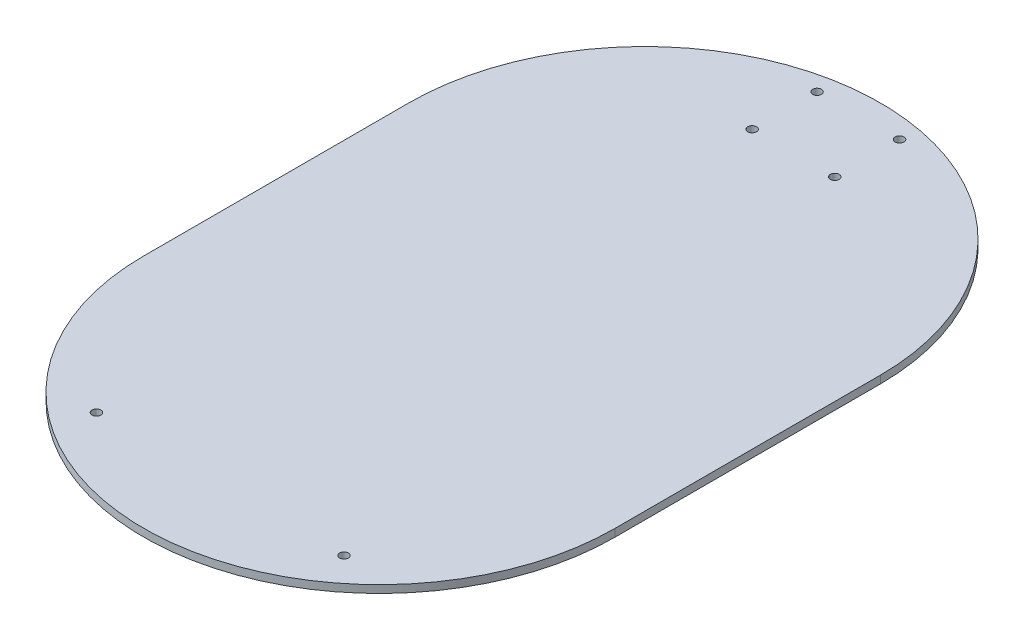
ISO-10303-21;
HEADER;
FILE_DESCRIPTION(('STEP AP214'),'2;1');
FILE_NAME('part.step','',(''),(''),'','','');
FILE_SCHEMA(('AUTOMOTIVE_DESIGN { 1 0 10303 214 1 1 1 1 }'));
ENDSEC;
DATA;
#1=APPLICATION_CONTEXT('core data for automotive mechanical design processes');
#2=APPLICATION_PROTOCOL_DEFINITION('international standard','automotive_design',2000,#1);
#3=PRODUCT_CONTEXT('',#1,'mechanical');
#4=PRODUCT('Part','Part','',(#3));
#5=PRODUCT_RELATED_PRODUCT_CATEGORY('part','',(#4));
#6=PRODUCT_DEFINITION_FORMATION('','',#4);
#7=PRODUCT_DEFINITION_CONTEXT('part definition',#1,'design');
#8=PRODUCT_DEFINITION('design','',#6,#7);
#9=PRODUCT_DEFINITION_SHAPE('','',#8);
#10=(LENGTH_UNIT() NAMED_UNIT(*) SI_UNIT(.MILLI.,.METRE.));
#11=(NAMED_UNIT(*) PLANE_ANGLE_UNIT() SI_UNIT($,.RADIAN.));
#12=(NAMED_UNIT(*) SI_UNIT($,.STERADIAN.) SOLID_ANGLE_UNIT());
#13=UNCERTAINTY_MEASURE_WITH_UNIT(LENGTH_MEASURE(1.E-05),#10,'distance_accuracy_value','');
#14=(GEOMETRIC_REPRESENTATION_CONTEXT(3) GLOBAL_UNCERTAINTY_ASSIGNED_CONTEXT((#13)) GLOBAL_UNIT_ASSIGNED_CONTEXT((#10,
#11,#12)) REPRESENTATION_CONTEXT('',''));
#15=CARTESIAN_POINT('',(0.,0.,0.));
#16=DIRECTION('',(0.,0.,1.));
#17=DIRECTION('',(1.,0.,0.));
#18=AXIS2_PLACEMENT_3D('',#15,#16,#17);
#19=CARTESIAN_POINT('',(80.,2.6,0.));
#20=DIRECTION('',(-1.,0.,0.));
#21=DIRECTION('',(0.,0.,1.));
#22=AXIS2_PLACEMENT_3D('',#19,#20,#21);
#23=PLANE('',#22);
#24=DIRECTION('',(0.,0.,-1.));
#25=VECTOR('',#24,1.);
#26=CARTESIAN_POINT('',(80.,0.,0.));
#27=LINE('',#26,#25);
#28=CARTESIAN_POINT('',(80.,0.,45.0000000000001));
#29=VERTEX_POINT('',#28);
#30=CARTESIAN_POINT('',(80.,0.,-45.0000000000001));
#31=VERTEX_POINT('',#30);
#32=EDGE_CURVE('E138',#29,#31,#27,.T.);
#33=ORIENTED_EDGE('',*,*,#32,.T.);
#34=DIRECTION('',(0.,-1.,0.));
#35=VECTOR('',#34,1.);
#36=CARTESIAN_POINT('',(80.,2.6,-45.0000000000001));
#37=LINE('',#36,#35);
#38=CARTESIAN_POINT('',(80.,2.6,-45.0000000000001));
#39=VERTEX_POINT('',#38);
#40=EDGE_CURVE('E11',#39,#31,#37,.T.);
#41=ORIENTED_EDGE('',*,*,#40,.F.);
#42=DIRECTION('',(0.,0.,-1.));
#43=VECTOR('',#42,1.);
#44=CARTESIAN_POINT('',(80.,2.6,0.));
#45=LINE('',#44,#43);
#46=CARTESIAN_POINT('',(80.,2.6,45.0000000000001));
#47=VERTEX_POINT('',#46);
#48=EDGE_CURVE('E95',#47,#39,#45,.T.);
#49=ORIENTED_EDGE('',*,*,#48,.F.);
#50=DIRECTION('',(0.,-1.,0.));
#51=VECTOR('',#50,1.);
#52=CARTESIAN_POINT('',(80.,2.6,45.0000000000001));
#53=LINE('',#52,#51);
#54=EDGE_CURVE('E133',#47,#29,#53,.T.);
#55=ORIENTED_EDGE('',*,*,#54,.T.);
#56=EDGE_LOOP('',(#33,#41,#49,#55));
#57=FACE_BOUND('',#56,.T.);
#58=ADVANCED_FACE('F45',(#57),#23,.F.);
#59=CARTESIAN_POINT('',(0.,2.6,-45.0000000000001));
#60=DIRECTION('',(0.,-1.,0.));
#61=DIRECTION('',(0.,0.,-1.));
#62=AXIS2_PLACEMENT_3D('',#59,#60,#61);
#63=CYLINDRICAL_SURFACE('',#62,80.);
#64=CARTESIAN_POINT('',(0.,0.,-45.0000000000001));
#65=DIRECTION('',(0.,1.,0.));
#66=DIRECTION('',(0.,0.,1.));
#67=AXIS2_PLACEMENT_3D('',#64,#65,#66);
#68=CIRCLE('',#67,80.);
#69=CARTESIAN_POINT('',(-80.,0.,-45.0000000000001));
#70=VERTEX_POINT('',#69);
#71=EDGE_CURVE('E101',#31,#70,#68,.T.);
#72=ORIENTED_EDGE('',*,*,#71,.T.);
#73=DIRECTION('',(0.,-1.,0.));
#74=VECTOR('',#73,1.);
#75=CARTESIAN_POINT('',(-80.,2.6,-45.0000000000001));
#76=LINE('',#75,#74);
#77=CARTESIAN_POINT('',(-80.,2.6,-45.0000000000001));
#78=VERTEX_POINT('',#77);
#79=EDGE_CURVE('E55',#78,#70,#76,.T.);
#80=ORIENTED_EDGE('',*,*,#79,.F.);
#81=CARTESIAN_POINT('',(0.,2.6,-45.0000000000001));
#82=DIRECTION('',(0.,1.,0.));
#83=DIRECTION('',(0.,0.,1.));
#84=AXIS2_PLACEMENT_3D('',#81,#82,#83);
#85=CIRCLE('',#84,80.);
#86=EDGE_CURVE('E89',#39,#78,#85,.T.);
#87=ORIENTED_EDGE('',*,*,#86,.F.);
#88=ORIENTED_EDGE('',*,*,#40,.T.);
#89=EDGE_LOOP('',(#72,#80,#87,#88));
#90=FACE_BOUND('',#89,.T.);
#91=ADVANCED_FACE('F100',(#90),#63,.T.);
#92=CARTESIAN_POINT('',(-80.,2.6,0.));
#93=DIRECTION('',(-1.,0.,0.));
#94=DIRECTION('',(0.,0.,1.));
#95=AXIS2_PLACEMENT_3D('',#92,#93,#94);
#96=PLANE('',#95);
#97=DIRECTION('',(0.,0.,-1.));
#98=VECTOR('',#97,1.);
#99=CARTESIAN_POINT('',(-80.,0.,0.));
#100=LINE('',#99,#98);
#101=CARTESIAN_POINT('',(-80.,0.,45.0000000000001));
#102=VERTEX_POINT('',#101);
#103=EDGE_CURVE('E144',#102,#70,#100,.T.);
#104=ORIENTED_EDGE('',*,*,#103,.F.);
#105=DIRECTION('',(0.,-1.,0.));
#106=VECTOR('',#105,1.);
#107=CARTESIAN_POINT('',(-80.,2.6,45.0000000000001));
#108=LINE('',#107,#106);
#109=CARTESIAN_POINT('',(-80.,2.6,45.0000000000001));
#110=VERTEX_POINT('',#109);
#111=EDGE_CURVE('E79',#110,#102,#108,.T.);
#112=ORIENTED_EDGE('',*,*,#111,.F.);
#113=DIRECTION('',(0.,0.,-1.));
#114=VECTOR('',#113,1.);
#115=CARTESIAN_POINT('',(-80.,2.6,0.));
#116=LINE('',#115,#114);
#117=EDGE_CURVE('E93',#110,#78,#116,.T.);
#118=ORIENTED_EDGE('',*,*,#117,.T.);
#119=ORIENTED_EDGE('',*,*,#79,.T.);
#120=EDGE_LOOP('',(#104,#112,#118,#119));
#121=FACE_BOUND('',#120,.T.);
#122=ADVANCED_FACE('F106',(#121),#96,.T.);
#123=CARTESIAN_POINT('',(42.,2.6,99.));
#124=DIRECTION('',(0.,-1.,0.));
#125=DIRECTION('',(0.,0.,-1.));
#126=AXIS2_PLACEMENT_3D('',#123,#124,#125);
#127=CYLINDRICAL_SURFACE('',#126,1.5);
#128=CARTESIAN_POINT('',(42.,2.6,99.));
#129=DIRECTION('',(0.,1.,0.));
#130=DIRECTION('',(0.,0.,1.));
#131=AXIS2_PLACEMENT_3D('',#128,#129,#130);
#132=CIRCLE('',#131,1.5);
#133=CARTESIAN_POINT('',(42.,2.6,100.5));
#134=VERTEX_POINT('',#133);
#135=EDGE_CURVE('E125',#134,#134,#132,.T.);
#136=ORIENTED_EDGE('',*,*,#135,.T.);
#137=EDGE_LOOP('',(#136));
#138=FACE_BOUND('',#137,.T.);
#139=CARTESIAN_POINT('',(42.,0.,99.));
#140=DIRECTION('',(0.,1.,0.));
#141=DIRECTION('',(0.,0.,1.));
#142=AXIS2_PLACEMENT_3D('',#139,#140,#141);
#143=CIRCLE('',#142,1.5);
#144=CARTESIAN_POINT('',(42.,0.,100.5));
#145=VERTEX_POINT('',#144);
#146=EDGE_CURVE('E161',#145,#145,#143,.T.);
#147=ORIENTED_EDGE('',*,*,#146,.F.);
#148=EDGE_LOOP('',(#147));
#149=FACE_BOUND('',#148,.T.);
#150=ADVANCED_FACE('F213',(#138,#149),#127,.F.);
#151=CARTESIAN_POINT('',(-14.,2.6,-95.5));
#152=DIRECTION('',(0.,-1.,0.));
#153=DIRECTION('',(0.,0.,-1.));
#154=AXIS2_PLACEMENT_3D('',#151,#152,#153);
#155=CYLINDRICAL_SURFACE('',#154,1.5);
#156=CARTESIAN_POINT('',(-14.,2.6,-95.5));
#157=DIRECTION('',(0.,1.,0.));
#158=DIRECTION('',(0.,0.,1.));
#159=AXIS2_PLACEMENT_3D('',#156,#157,#158);
#160=CIRCLE('',#159,1.5);
#161=CARTESIAN_POINT('',(-14.,2.6,-94.));
#162=VERTEX_POINT('',#161);
#163=EDGE_CURVE('E121',#162,#162,#160,.F.);
#164=ORIENTED_EDGE('',*,*,#163,.F.);
#165=EDGE_LOOP('',(#164));
#166=FACE_BOUND('',#165,.T.);
#167=CARTESIAN_POINT('',(-14.,0.,-95.5));
#168=DIRECTION('',(0.,1.,0.));
#169=DIRECTION('',(0.,0.,1.));
#170=AXIS2_PLACEMENT_3D('',#167,#168,#169);
#171=CIRCLE('',#170,1.5);
#172=CARTESIAN_POINT('',(-14.,0.,-94.));
#173=VERTEX_POINT('',#172);
#174=EDGE_CURVE('E157',#173,#173,#171,.F.);
#175=ORIENTED_EDGE('',*,*,#174,.T.);
#176=EDGE_LOOP('',(#175));
#177=FACE_BOUND('',#176,.T.);
#178=ADVANCED_FACE('F223',(#166,#177),#155,.F.);
#179=CARTESIAN_POINT('',(14.,2.6,-95.5));
#180=DIRECTION('',(0.,-1.,0.));
#181=DIRECTION('',(0.,0.,-1.));
#182=AXIS2_PLACEMENT_3D('',#179,#180,#181);
#183=CYLINDRICAL_SURFACE('',#182,1.5);
#184=CARTESIAN_POINT('',(14.,2.6,-95.5));
#185=DIRECTION('',(0.,1.,0.));
#186=DIRECTION('',(0.,0.,1.));
#187=AXIS2_PLACEMENT_3D('',#184,#185,#186);
#188=CIRCLE('',#187,1.5);
#189=CARTESIAN_POINT('',(14.,2.6,-94.));
#190=VERTEX_POINT('',#189);
#191=EDGE_CURVE('E117',#190,#190,#188,.T.);
#192=ORIENTED_EDGE('',*,*,#191,.T.);
#193=EDGE_LOOP('',(#192));
#194=FACE_BOUND('',#193,.T.);
#195=CARTESIAN_POINT('',(14.,0.,-95.5));
#196=DIRECTION('',(0.,1.,0.));
#197=DIRECTION('',(0.,0.,1.));
#198=AXIS2_PLACEMENT_3D('',#195,#196,#197);
#199=CIRCLE('',#198,1.5);
#200=CARTESIAN_POINT('',(14.,0.,-94.));
#201=VERTEX_POINT('',#200);
#202=EDGE_CURVE('E153',#201,#201,#199,.T.);
#203=ORIENTED_EDGE('',*,*,#202,.F.);
#204=EDGE_LOOP('',(#203));
#205=FACE_BOUND('',#204,.T.);
#206=ADVANCED_FACE('F219',(#194,#205),#183,.F.);
#207=CARTESIAN_POINT('',(14.,2.6,-117.5));
#208=DIRECTION('',(0.,-1.,0.));
#209=DIRECTION('',(0.,0.,-1.));
#210=AXIS2_PLACEMENT_3D('',#207,#208,#209);
#211=CYLINDRICAL_SURFACE('',#210,1.5);
#212=CARTESIAN_POINT('',(14.,2.6,-117.5));
#213=DIRECTION('',(0.,1.,0.));
#214=DIRECTION('',(0.,0.,1.));
#215=AXIS2_PLACEMENT_3D('',#212,#213,#214);
#216=CIRCLE('',#215,1.5);
#217=CARTESIAN_POINT('',(14.,2.6,-116.));
#218=VERTEX_POINT('',#217);
#219=EDGE_CURVE('E110',#218,#218,#216,.T.);
#220=ORIENTED_EDGE('',*,*,#219,.T.);
#221=EDGE_LOOP('',(#220));
#222=FACE_BOUND('',#221,.T.);
#223=CARTESIAN_POINT('',(14.,0.,-117.5));
#224=DIRECTION('',(0.,1.,0.));
#225=DIRECTION('',(0.,0.,1.));
#226=AXIS2_PLACEMENT_3D('',#223,#224,#225);
#227=CIRCLE('',#226,1.5);
#228=CARTESIAN_POINT('',(14.,0.,-116.));
#229=VERTEX_POINT('',#228);
#230=EDGE_CURVE('E149',#229,#229,#227,.T.);
#231=ORIENTED_EDGE('',*,*,#230,.F.);
#232=EDGE_LOOP('',(#231));
#233=FACE_BOUND('',#232,.T.);
#234=ADVANCED_FACE('F216',(#222,#233),#211,.F.);
#235=CARTESIAN_POINT('',(0.,2.6,45.0000000000001));
#236=DIRECTION('',(0.,-1.,0.));
#237=DIRECTION('',(0.,0.,-1.));
#238=AXIS2_PLACEMENT_3D('',#235,#236,#237);
#239=CYLINDRICAL_SURFACE('',#238,80.);
#240=CARTESIAN_POINT('',(0.,0.,45.0000000000001));
#241=DIRECTION('',(0.,1.,0.));
#242=DIRECTION('',(0.,0.,1.));
#243=AXIS2_PLACEMENT_3D('',#240,#241,#242);
#244=CIRCLE('',#243,80.);
#245=EDGE_CURVE('E82',#102,#29,#244,.T.);
#246=ORIENTED_EDGE('',*,*,#245,.T.);
#247=ORIENTED_EDGE('',*,*,#54,.F.);
#248=CARTESIAN_POINT('',(0.,2.6,45.0000000000001));
#249=DIRECTION('',(0.,1.,0.));
#250=DIRECTION('',(0.,0.,1.));
#251=AXIS2_PLACEMENT_3D('',#248,#249,#250);
#252=CIRCLE('',#251,80.);
#253=EDGE_CURVE('E63',#110,#47,#252,.T.);
#254=ORIENTED_EDGE('',*,*,#253,.F.);
#255=ORIENTED_EDGE('',*,*,#111,.T.);
#256=EDGE_LOOP('',(#246,#247,#254,#255));
#257=FACE_BOUND('',#256,.T.);
#258=ADVANCED_FACE('F201',(#257),#239,.T.);
#259=CARTESIAN_POINT('',(-14.,2.6,-117.5));
#260=DIRECTION('',(0.,-1.,0.));
#261=DIRECTION('',(0.,0.,-1.));
#262=AXIS2_PLACEMENT_3D('',#259,#260,#261);
#263=CYLINDRICAL_SURFACE('',#262,1.5);
#264=CARTESIAN_POINT('',(-14.,2.6,-117.5));
#265=DIRECTION('',(0.,1.,0.));
#266=DIRECTION('',(0.,0.,1.));
#267=AXIS2_PLACEMENT_3D('',#264,#265,#266);
#268=CIRCLE('',#267,1.5);
#269=CARTESIAN_POINT('',(-14.,2.6,-116.));
#270=VERTEX_POINT('',#269);
#271=EDGE_CURVE('E169',#270,#270,#268,.F.);
#272=ORIENTED_EDGE('',*,*,#271,.F.);
#273=EDGE_LOOP('',(#272));
#274=FACE_BOUND('',#273,.T.);
#275=CARTESIAN_POINT('',(-14.,0.,-117.5));
#276=DIRECTION('',(0.,1.,0.));
#277=DIRECTION('',(0.,0.,1.));
#278=AXIS2_PLACEMENT_3D('',#275,#276,#277);
#279=CIRCLE('',#278,1.5);
#280=CARTESIAN_POINT('',(-14.,0.,-116.));
#281=VERTEX_POINT('',#280);
#282=EDGE_CURVE('E134',#281,#281,#279,.F.);
#283=ORIENTED_EDGE('',*,*,#282,.T.);
#284=EDGE_LOOP('',(#283));
#285=FACE_BOUND('',#284,.T.);
#286=ADVANCED_FACE('F47',(#274,#285),#263,.F.);
#287=CARTESIAN_POINT('',(-42.,2.6,99.));
#288=DIRECTION('',(0.,-1.,0.));
#289=DIRECTION('',(0.,0.,-1.));
#290=AXIS2_PLACEMENT_3D('',#287,#288,#289);
#291=CYLINDRICAL_SURFACE('',#290,1.5);
#292=CARTESIAN_POINT('',(-42.,2.6,99.));
#293=DIRECTION('',(0.,1.,0.));
#294=DIRECTION('',(0.,0.,1.));
#295=AXIS2_PLACEMENT_3D('',#292,#293,#294);
#296=CIRCLE('',#295,1.5);
#297=CARTESIAN_POINT('',(-42.,2.6,100.5));
#298=VERTEX_POINT('',#297);
#299=EDGE_CURVE('E129',#298,#298,#296,.F.);
#300=ORIENTED_EDGE('',*,*,#299,.F.);
#301=EDGE_LOOP('',(#300));
#302=FACE_BOUND('',#301,.T.);
#303=CARTESIAN_POINT('',(-42.,0.,99.));
#304=DIRECTION('',(0.,1.,0.));
#305=DIRECTION('',(0.,0.,1.));
#306=AXIS2_PLACEMENT_3D('',#303,#304,#305);
#307=CIRCLE('',#306,1.5);
#308=CARTESIAN_POINT('',(-42.,0.,100.5));
#309=VERTEX_POINT('',#308);
#310=EDGE_CURVE('E165',#309,#309,#307,.F.);
#311=ORIENTED_EDGE('',*,*,#310,.T.);
#312=EDGE_LOOP('',(#311));
#313=FACE_BOUND('',#312,.T.);
#314=ADVANCED_FACE('F191',(#302,#313),#291,.F.);
#315=CARTESIAN_POINT('',(0.,2.6,0.));
#316=DIRECTION('',(0.,1.,0.));
#317=DIRECTION('',(0.,0.,1.));
#318=AXIS2_PLACEMENT_3D('',#315,#316,#317);
#319=PLANE('',#318);
#320=ORIENTED_EDGE('',*,*,#271,.T.);
#321=EDGE_LOOP('',(#320));
#322=FACE_BOUND('',#321,.T.);
#323=ORIENTED_EDGE('',*,*,#48,.T.);
#324=ORIENTED_EDGE('',*,*,#86,.T.);
#325=ORIENTED_EDGE('',*,*,#117,.F.);
#326=ORIENTED_EDGE('',*,*,#253,.T.);
#327=EDGE_LOOP('',(#323,#324,#325,#326));
#328=FACE_BOUND('',#327,.T.);
#329=ORIENTED_EDGE('',*,*,#219,.F.);
#330=EDGE_LOOP('',(#329));
#331=FACE_BOUND('',#330,.T.);
#332=ORIENTED_EDGE('',*,*,#191,.F.);
#333=EDGE_LOOP('',(#332));
#334=FACE_BOUND('',#333,.T.);
#335=ORIENTED_EDGE('',*,*,#163,.T.);
#336=EDGE_LOOP('',(#335));
#337=FACE_BOUND('',#336,.T.);
#338=ORIENTED_EDGE('',*,*,#135,.F.);
#339=EDGE_LOOP('',(#338));
#340=FACE_BOUND('',#339,.T.);
#341=ORIENTED_EDGE('',*,*,#299,.T.);
#342=EDGE_LOOP('',(#341));
#343=FACE_BOUND('',#342,.T.);
#344=ADVANCED_FACE('F90',(#322,#328,#331,#334,#337,#340,#343),#319,.T.);
#345=CARTESIAN_POINT('',(0.,0.,0.));
#346=DIRECTION('',(0.,1.,0.));
#347=DIRECTION('',(0.,0.,1.));
#348=AXIS2_PLACEMENT_3D('',#345,#346,#347);
#349=PLANE('',#348);
#350=ORIENTED_EDGE('',*,*,#282,.F.);
#351=EDGE_LOOP('',(#350));
#352=FACE_BOUND('',#351,.T.);
#353=ORIENTED_EDGE('',*,*,#32,.F.);
#354=ORIENTED_EDGE('',*,*,#245,.F.);
#355=ORIENTED_EDGE('',*,*,#103,.T.);
#356=ORIENTED_EDGE('',*,*,#71,.F.);
#357=EDGE_LOOP('',(#353,#354,#355,#356));
#358=FACE_BOUND('',#357,.T.);
#359=ORIENTED_EDGE('',*,*,#230,.T.);
#360=EDGE_LOOP('',(#359));
#361=FACE_BOUND('',#360,.T.);
#362=ORIENTED_EDGE('',*,*,#202,.T.);
#363=EDGE_LOOP('',(#362));
#364=FACE_BOUND('',#363,.T.);
#365=ORIENTED_EDGE('',*,*,#174,.F.);
#366=EDGE_LOOP('',(#365));
#367=FACE_BOUND('',#366,.T.);
#368=ORIENTED_EDGE('',*,*,#146,.T.);
#369=EDGE_LOOP('',(#368));
#370=FACE_BOUND('',#369,.T.);
#371=ORIENTED_EDGE('',*,*,#310,.F.);
#372=EDGE_LOOP('',(#371));
#373=FACE_BOUND('',#372,.T.);
#374=ADVANCED_FACE('F176',(#352,#358,#361,#364,#367,#370,#373),#349,.F.);
#375=CLOSED_SHELL('',(#58,#91,#122,#150,#178,#206,#234,#258,#286,#314,#344,#374));
#376=MANIFOLD_SOLID_BREP('B2',#375);
#377=ADVANCED_BREP_SHAPE_REPRESENTATION('',(#18,#376),#14);
#378=SHAPE_DEFINITION_REPRESENTATION(#9,#377);
ENDSEC;
END-ISO-10303-21;
